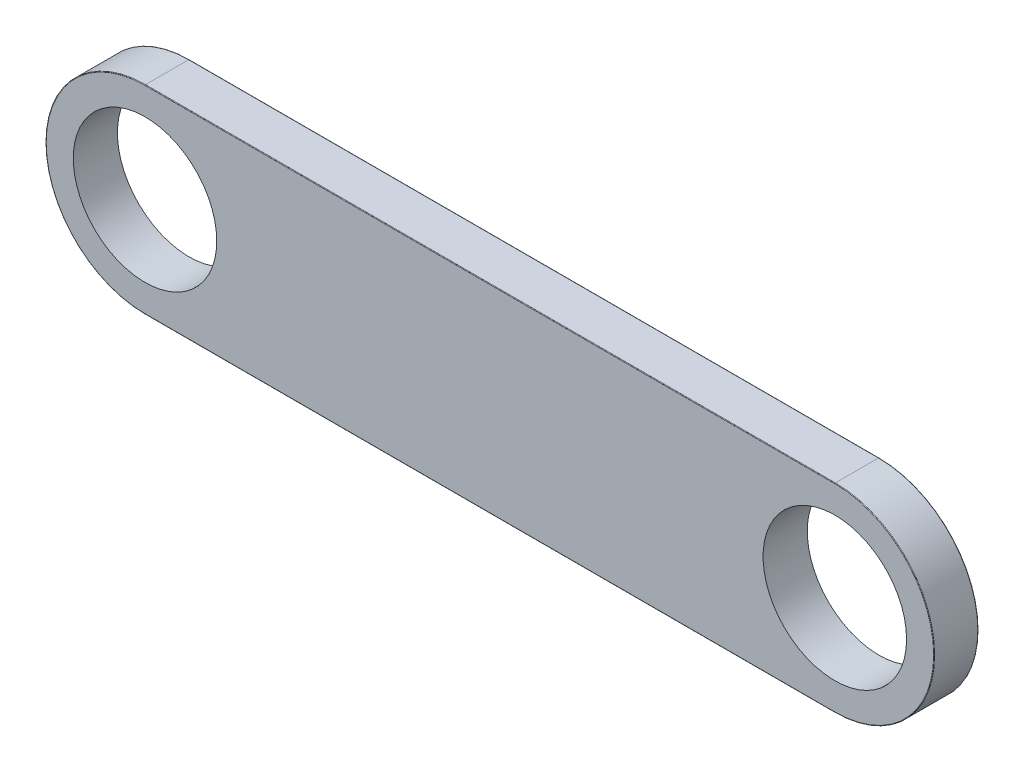
ISO-10303-21;
HEADER;
FILE_DESCRIPTION(('STEP AP214'),'2;1');
FILE_NAME('part.step','',(''),(''),'','','');
FILE_SCHEMA(('AUTOMOTIVE_DESIGN { 1 0 10303 214 1 1 1 1 }'));
ENDSEC;
DATA;
#1=APPLICATION_CONTEXT('core data for automotive mechanical design processes');
#2=APPLICATION_PROTOCOL_DEFINITION('international standard','automotive_design',2000,#1);
#3=PRODUCT_CONTEXT('',#1,'mechanical');
#4=PRODUCT('Part','Part','',(#3));
#5=PRODUCT_RELATED_PRODUCT_CATEGORY('part','',(#4));
#6=PRODUCT_DEFINITION_FORMATION('','',#4);
#7=PRODUCT_DEFINITION_CONTEXT('part definition',#1,'design');
#8=PRODUCT_DEFINITION('design','',#6,#7);
#9=PRODUCT_DEFINITION_SHAPE('','',#8);
#10=(LENGTH_UNIT() NAMED_UNIT(*) SI_UNIT(.MILLI.,.METRE.));
#11=(NAMED_UNIT(*) PLANE_ANGLE_UNIT() SI_UNIT($,.RADIAN.));
#12=(NAMED_UNIT(*) SI_UNIT($,.STERADIAN.) SOLID_ANGLE_UNIT());
#13=UNCERTAINTY_MEASURE_WITH_UNIT(LENGTH_MEASURE(1.E-05),#10,'distance_accuracy_value','');
#14=(GEOMETRIC_REPRESENTATION_CONTEXT(3) GLOBAL_UNCERTAINTY_ASSIGNED_CONTEXT((#13)) GLOBAL_UNIT_ASSIGNED_CONTEXT((#10,
#11,#12)) REPRESENTATION_CONTEXT('',''));
#15=CARTESIAN_POINT('',(0.,0.,0.));
#16=DIRECTION('',(0.,0.,1.));
#17=DIRECTION('',(1.,0.,0.));
#18=AXIS2_PLACEMENT_3D('',#15,#16,#17);
#19=CARTESIAN_POINT('',(0.,0.,8.));
#20=DIRECTION('',(0.,0.,1.));
#21=DIRECTION('',(1.,0.,0.));
#22=AXIS2_PLACEMENT_3D('',#19,#20,#21);
#23=PLANE('',#22);
#24=DIRECTION('',(1.,0.,0.));
#25=VECTOR('',#24,1.);
#26=CARTESIAN_POINT('',(125.,-17.9,8.));
#27=LINE('',#26,#25);
#28=CARTESIAN_POINT('',(0.,-17.9,8.));
#29=VERTEX_POINT('',#28);
#30=CARTESIAN_POINT('',(125.,-17.9,8.));
#31=VERTEX_POINT('',#30);
#32=EDGE_CURVE('E52',#29,#31,#27,.T.);
#33=ORIENTED_EDGE('',*,*,#32,.T.);
#34=CARTESIAN_POINT('',(125.,0.,8.));
#35=DIRECTION('',(0.,0.,1.));
#36=DIRECTION('',(1.,0.,0.));
#37=AXIS2_PLACEMENT_3D('',#34,#35,#36);
#38=CIRCLE('',#37,17.9);
#39=CARTESIAN_POINT('',(125.,17.9,8.));
#40=VERTEX_POINT('',#39);
#41=EDGE_CURVE('E111',#31,#40,#38,.T.);
#42=ORIENTED_EDGE('',*,*,#41,.T.);
#43=DIRECTION('',(-1.,0.,0.));
#44=VECTOR('',#43,1.);
#45=CARTESIAN_POINT('',(0.,17.9,8.));
#46=LINE('',#45,#44);
#47=CARTESIAN_POINT('',(0.,17.9,8.));
#48=VERTEX_POINT('',#47);
#49=EDGE_CURVE('E135',#40,#48,#46,.T.);
#50=ORIENTED_EDGE('',*,*,#49,.T.);
#51=CARTESIAN_POINT('',(0.,0.,8.));
#52=DIRECTION('',(0.,0.,1.));
#53=DIRECTION('',(1.,0.,0.));
#54=AXIS2_PLACEMENT_3D('',#51,#52,#53);
#55=CIRCLE('',#54,17.9);
#56=EDGE_CURVE('E57',#48,#29,#55,.T.);
#57=ORIENTED_EDGE('',*,*,#56,.T.);
#58=EDGE_LOOP('',(#33,#42,#50,#57));
#59=FACE_BOUND('',#58,.T.);
#60=CARTESIAN_POINT('',(0.,0.,8.));
#61=DIRECTION('',(0.,0.,1.));
#62=DIRECTION('',(1.,0.,0.));
#63=AXIS2_PLACEMENT_3D('',#60,#61,#62);
#64=CIRCLE('',#63,13.);
#65=CARTESIAN_POINT('',(13.,0.,8.));
#66=VERTEX_POINT('',#65);
#67=EDGE_CURVE('E172',#66,#66,#64,.T.);
#68=ORIENTED_EDGE('',*,*,#67,.F.);
#69=EDGE_LOOP('',(#68));
#70=FACE_BOUND('',#69,.T.);
#71=CARTESIAN_POINT('',(125.,0.,8.));
#72=DIRECTION('',(0.,0.,1.));
#73=DIRECTION('',(1.,0.,0.));
#74=AXIS2_PLACEMENT_3D('',#71,#72,#73);
#75=CIRCLE('',#74,13.);
#76=CARTESIAN_POINT('',(138.,0.,8.));
#77=VERTEX_POINT('',#76);
#78=EDGE_CURVE('E164',#77,#77,#75,.T.);
#79=ORIENTED_EDGE('',*,*,#78,.F.);
#80=EDGE_LOOP('',(#79));
#81=FACE_BOUND('',#80,.T.);
#82=ADVANCED_FACE('F35',(#59,#70,#81),#23,.T.);
#83=CARTESIAN_POINT('',(0.,0.,0.));
#84=DIRECTION('',(0.,0.,1.));
#85=DIRECTION('',(1.,0.,0.));
#86=AXIS2_PLACEMENT_3D('',#83,#84,#85);
#87=PLANE('',#86);
#88=DIRECTION('',(-1.,0.,0.));
#89=VECTOR('',#88,1.);
#90=CARTESIAN_POINT('',(0.,17.9,0.));
#91=LINE('',#90,#89);
#92=CARTESIAN_POINT('',(0.,17.9,0.));
#93=VERTEX_POINT('',#92);
#94=CARTESIAN_POINT('',(125.,17.9,0.));
#95=VERTEX_POINT('',#94);
#96=EDGE_CURVE('E182',#93,#95,#91,.F.);
#97=ORIENTED_EDGE('',*,*,#96,.T.);
#98=CARTESIAN_POINT('',(125.,0.,0.));
#99=DIRECTION('',(0.,0.,1.));
#100=DIRECTION('',(1.,0.,0.));
#101=AXIS2_PLACEMENT_3D('',#98,#99,#100);
#102=CIRCLE('',#101,17.9);
#103=CARTESIAN_POINT('',(125.,-17.9,0.));
#104=VERTEX_POINT('',#103);
#105=EDGE_CURVE('E188',#95,#104,#102,.F.);
#106=ORIENTED_EDGE('',*,*,#105,.T.);
#107=DIRECTION('',(1.,0.,0.));
#108=VECTOR('',#107,1.);
#109=CARTESIAN_POINT('',(0.,-17.9,0.));
#110=LINE('',#109,#108);
#111=CARTESIAN_POINT('',(0.,-17.9,0.));
#112=VERTEX_POINT('',#111);
#113=EDGE_CURVE('E186',#104,#112,#110,.F.);
#114=ORIENTED_EDGE('',*,*,#113,.T.);
#115=CARTESIAN_POINT('',(0.,0.,0.));
#116=DIRECTION('',(0.,0.,1.));
#117=DIRECTION('',(1.,0.,0.));
#118=AXIS2_PLACEMENT_3D('',#115,#116,#117);
#119=CIRCLE('',#118,17.9);
#120=EDGE_CURVE('E184',#112,#93,#119,.F.);
#121=ORIENTED_EDGE('',*,*,#120,.T.);
#122=EDGE_LOOP('',(#97,#106,#114,#121));
#123=FACE_BOUND('',#122,.T.);
#124=CARTESIAN_POINT('',(0.,0.,0.));
#125=DIRECTION('',(0.,0.,1.));
#126=DIRECTION('',(1.,0.,0.));
#127=AXIS2_PLACEMENT_3D('',#124,#125,#126);
#128=CIRCLE('',#127,13.);
#129=CARTESIAN_POINT('',(13.,0.,0.));
#130=VERTEX_POINT('',#129);
#131=EDGE_CURVE('E169',#130,#130,#128,.T.);
#132=ORIENTED_EDGE('',*,*,#131,.T.);
#133=EDGE_LOOP('',(#132));
#134=FACE_BOUND('',#133,.T.);
#135=CARTESIAN_POINT('',(125.,0.,0.));
#136=DIRECTION('',(0.,0.,1.));
#137=DIRECTION('',(1.,0.,0.));
#138=AXIS2_PLACEMENT_3D('',#135,#136,#137);
#139=CIRCLE('',#138,13.);
#140=CARTESIAN_POINT('',(138.,0.,0.));
#141=VERTEX_POINT('',#140);
#142=EDGE_CURVE('E158',#141,#141,#139,.T.);
#143=ORIENTED_EDGE('',*,*,#142,.T.);
#144=EDGE_LOOP('',(#143));
#145=FACE_BOUND('',#144,.T.);
#146=ADVANCED_FACE('F228',(#123,#134,#145),#87,.F.);
#147=CARTESIAN_POINT('',(0.,0.,8.));
#148=DIRECTION('',(0.,0.,-1.));
#149=DIRECTION('',(-1.,0.,0.));
#150=AXIS2_PLACEMENT_3D('',#147,#148,#149);
#151=CYLINDRICAL_SURFACE('',#150,18.);
#152=DIRECTION('',(0.,0.,-1.));
#153=VECTOR('',#152,1.);
#154=CARTESIAN_POINT('',(0.,18.,8.));
#155=LINE('',#154,#153);
#156=CARTESIAN_POINT('',(0.,18.,7.9));
#157=VERTEX_POINT('',#156);
#158=CARTESIAN_POINT('',(0.,18.,0.0999999999999994));
#159=VERTEX_POINT('',#158);
#160=EDGE_CURVE('E106',#157,#159,#155,.T.);
#161=ORIENTED_EDGE('',*,*,#160,.T.);
#162=CARTESIAN_POINT('',(0.,0.,0.0999999999999994));
#163=DIRECTION('',(0.,0.,1.));
#164=DIRECTION('',(1.,0.,0.));
#165=AXIS2_PLACEMENT_3D('',#162,#163,#164);
#166=CIRCLE('',#165,18.);
#167=CARTESIAN_POINT('',(0.,-18.,0.0999999999999994));
#168=VERTEX_POINT('',#167);
#169=EDGE_CURVE('E197',#159,#168,#166,.T.);
#170=ORIENTED_EDGE('',*,*,#169,.T.);
#171=DIRECTION('',(0.,0.,-1.));
#172=VECTOR('',#171,1.);
#173=CARTESIAN_POINT('',(0.,-18.,8.));
#174=LINE('',#173,#172);
#175=CARTESIAN_POINT('',(0.,-18.,7.9));
#176=VERTEX_POINT('',#175);
#177=EDGE_CURVE('E132',#176,#168,#174,.T.);
#178=ORIENTED_EDGE('',*,*,#177,.F.);
#179=CARTESIAN_POINT('',(0.,0.,7.9));
#180=DIRECTION('',(0.,0.,1.));
#181=DIRECTION('',(1.,0.,0.));
#182=AXIS2_PLACEMENT_3D('',#179,#180,#181);
#183=CIRCLE('',#182,18.);
#184=EDGE_CURVE('E195',#176,#157,#183,.F.);
#185=ORIENTED_EDGE('',*,*,#184,.T.);
#186=EDGE_LOOP('',(#161,#170,#178,#185));
#187=FACE_BOUND('',#186,.T.);
#188=ADVANCED_FACE('F210',(#187),#151,.T.);
#189=CARTESIAN_POINT('',(0.,-18.,8.));
#190=DIRECTION('',(0.,1.,0.));
#191=DIRECTION('',(0.,0.,1.));
#192=AXIS2_PLACEMENT_3D('',#189,#190,#191);
#193=PLANE('',#192);
#194=ORIENTED_EDGE('',*,*,#177,.T.);
#195=DIRECTION('',(1.,0.,0.));
#196=VECTOR('',#195,1.);
#197=CARTESIAN_POINT('',(0.,-18.,0.0999999999999994));
#198=LINE('',#197,#196);
#199=CARTESIAN_POINT('',(125.,-18.,0.0999999999999994));
#200=VERTEX_POINT('',#199);
#201=EDGE_CURVE('E193',#168,#200,#198,.T.);
#202=ORIENTED_EDGE('',*,*,#201,.T.);
#203=DIRECTION('',(0.,0.,-1.));
#204=VECTOR('',#203,1.);
#205=CARTESIAN_POINT('',(125.,-18.,8.));
#206=LINE('',#205,#204);
#207=CARTESIAN_POINT('',(125.,-18.,7.9));
#208=VERTEX_POINT('',#207);
#209=EDGE_CURVE('E123',#208,#200,#206,.T.);
#210=ORIENTED_EDGE('',*,*,#209,.F.);
#211=DIRECTION('',(1.,0.,0.));
#212=VECTOR('',#211,1.);
#213=CARTESIAN_POINT('',(0.,-18.,7.9));
#214=LINE('',#213,#212);
#215=EDGE_CURVE('E191',#208,#176,#214,.F.);
#216=ORIENTED_EDGE('',*,*,#215,.T.);
#217=EDGE_LOOP('',(#194,#202,#210,#216));
#218=FACE_BOUND('',#217,.T.);
#219=ADVANCED_FACE('F208',(#218),#193,.F.);
#220=CARTESIAN_POINT('',(125.,0.,8.));
#221=DIRECTION('',(0.,0.,-1.));
#222=DIRECTION('',(-1.,0.,0.));
#223=AXIS2_PLACEMENT_3D('',#220,#221,#222);
#224=CYLINDRICAL_SURFACE('',#223,18.);
#225=ORIENTED_EDGE('',*,*,#209,.T.);
#226=CARTESIAN_POINT('',(125.,0.,0.0999999999999994));
#227=DIRECTION('',(0.,0.,1.));
#228=DIRECTION('',(1.,0.,0.));
#229=AXIS2_PLACEMENT_3D('',#226,#227,#228);
#230=CIRCLE('',#229,18.);
#231=CARTESIAN_POINT('',(125.,18.,0.0999999999999994));
#232=VERTEX_POINT('',#231);
#233=EDGE_CURVE('E122',#200,#232,#230,.T.);
#234=ORIENTED_EDGE('',*,*,#233,.T.);
#235=DIRECTION('',(0.,0.,-1.));
#236=VECTOR('',#235,1.);
#237=CARTESIAN_POINT('',(125.,18.,8.));
#238=LINE('',#237,#236);
#239=CARTESIAN_POINT('',(125.,18.,7.9));
#240=VERTEX_POINT('',#239);
#241=EDGE_CURVE('E104',#240,#232,#238,.T.);
#242=ORIENTED_EDGE('',*,*,#241,.F.);
#243=CARTESIAN_POINT('',(125.,0.,7.9));
#244=DIRECTION('',(0.,0.,1.));
#245=DIRECTION('',(1.,0.,0.));
#246=AXIS2_PLACEMENT_3D('',#243,#244,#245);
#247=CIRCLE('',#246,18.);
#248=EDGE_CURVE('E119',#240,#208,#247,.F.);
#249=ORIENTED_EDGE('',*,*,#248,.T.);
#250=EDGE_LOOP('',(#225,#234,#242,#249));
#251=FACE_BOUND('',#250,.T.);
#252=ADVANCED_FACE('F118',(#251),#224,.T.);
#253=CARTESIAN_POINT('',(0.,18.,8.));
#254=DIRECTION('',(0.,-1.,0.));
#255=DIRECTION('',(0.,0.,-1.));
#256=AXIS2_PLACEMENT_3D('',#253,#254,#255);
#257=PLANE('',#256);
#258=ORIENTED_EDGE('',*,*,#241,.T.);
#259=DIRECTION('',(-1.,0.,0.));
#260=VECTOR('',#259,1.);
#261=CARTESIAN_POINT('',(0.,18.,0.0999999999999994));
#262=LINE('',#261,#260);
#263=EDGE_CURVE('E11',#232,#159,#262,.T.);
#264=ORIENTED_EDGE('',*,*,#263,.T.);
#265=ORIENTED_EDGE('',*,*,#160,.F.);
#266=DIRECTION('',(-1.,0.,0.));
#267=VECTOR('',#266,1.);
#268=CARTESIAN_POINT('',(125.,18.,7.9));
#269=LINE('',#268,#267);
#270=EDGE_CURVE('E44',#157,#240,#269,.F.);
#271=ORIENTED_EDGE('',*,*,#270,.T.);
#272=EDGE_LOOP('',(#258,#264,#265,#271));
#273=FACE_BOUND('',#272,.T.);
#274=ADVANCED_FACE('F103',(#273),#257,.F.);
#275=CARTESIAN_POINT('',(0.,0.,8.));
#276=DIRECTION('',(0.,0.,-1.));
#277=DIRECTION('',(-1.,0.,0.));
#278=AXIS2_PLACEMENT_3D('',#275,#276,#277);
#279=CYLINDRICAL_SURFACE('',#278,13.);
#280=ORIENTED_EDGE('',*,*,#67,.T.);
#281=EDGE_LOOP('',(#280));
#282=FACE_BOUND('',#281,.T.);
#283=ORIENTED_EDGE('',*,*,#131,.F.);
#284=EDGE_LOOP('',(#283));
#285=FACE_BOUND('',#284,.T.);
#286=ADVANCED_FACE('F237',(#282,#285),#279,.F.);
#287=CARTESIAN_POINT('',(125.,0.,8.));
#288=DIRECTION('',(0.,0.,-1.));
#289=DIRECTION('',(-1.,0.,0.));
#290=AXIS2_PLACEMENT_3D('',#287,#288,#289);
#291=CYLINDRICAL_SURFACE('',#290,13.);
#292=ORIENTED_EDGE('',*,*,#78,.T.);
#293=EDGE_LOOP('',(#292));
#294=FACE_BOUND('',#293,.T.);
#295=ORIENTED_EDGE('',*,*,#142,.F.);
#296=EDGE_LOOP('',(#295));
#297=FACE_BOUND('',#296,.T.);
#298=ADVANCED_FACE('F270',(#294,#297),#291,.F.);
#299=CARTESIAN_POINT('',(0.,0.,0.0999999999999994));
#300=DIRECTION('',(0.,0.,1.));
#301=DIRECTION('',(1.,0.,0.));
#302=AXIS2_PLACEMENT_3D('',#299,#300,#301);
#303=TOROIDAL_SURFACE('',#302,17.9,0.1);
#304=CARTESIAN_POINT('',(0.,17.9,0.1));
#305=DIRECTION('',(1.,0.,0.));
#306=DIRECTION('',(0.,0.,-1.));
#307=AXIS2_PLACEMENT_3D('',#304,#305,#306);
#308=CIRCLE('',#307,0.1);
#309=EDGE_CURVE('E151',#93,#159,#308,.T.);
#310=ORIENTED_EDGE('',*,*,#309,.F.);
#311=ORIENTED_EDGE('',*,*,#120,.F.);
#312=CARTESIAN_POINT('',(0.,-17.9,0.0999999999999994));
#313=DIRECTION('',(1.,0.,0.));
#314=DIRECTION('',(0.,0.,-1.));
#315=AXIS2_PLACEMENT_3D('',#312,#313,#314);
#316=CIRCLE('',#315,0.1);
#317=EDGE_CURVE('E140',#168,#112,#316,.T.);
#318=ORIENTED_EDGE('',*,*,#317,.F.);
#319=ORIENTED_EDGE('',*,*,#169,.F.);
#320=EDGE_LOOP('',(#310,#311,#318,#319));
#321=FACE_BOUND('',#320,.T.);
#322=ADVANCED_FACE('F213',(#321),#303,.T.);
#323=CARTESIAN_POINT('',(0.,-17.9,0.0999999999999994));
#324=DIRECTION('',(1.,0.,0.));
#325=DIRECTION('',(0.,0.,-1.));
#326=AXIS2_PLACEMENT_3D('',#323,#324,#325);
#327=CYLINDRICAL_SURFACE('',#326,0.1);
#328=ORIENTED_EDGE('',*,*,#317,.T.);
#329=ORIENTED_EDGE('',*,*,#113,.F.);
#330=CARTESIAN_POINT('',(125.,-17.9,0.0999999999999994));
#331=DIRECTION('',(1.,0.,0.));
#332=DIRECTION('',(0.,0.,-1.));
#333=AXIS2_PLACEMENT_3D('',#330,#331,#332);
#334=CIRCLE('',#333,0.1);
#335=EDGE_CURVE('E145',#200,#104,#334,.T.);
#336=ORIENTED_EDGE('',*,*,#335,.F.);
#337=ORIENTED_EDGE('',*,*,#201,.F.);
#338=EDGE_LOOP('',(#328,#329,#336,#337));
#339=FACE_BOUND('',#338,.T.);
#340=ADVANCED_FACE('F216',(#339),#327,.T.);
#341=CARTESIAN_POINT('',(0.,17.9,0.0999999999999994));
#342=DIRECTION('',(-1.,0.,0.));
#343=DIRECTION('',(0.,0.,1.));
#344=AXIS2_PLACEMENT_3D('',#341,#342,#343);
#345=CYLINDRICAL_SURFACE('',#344,0.1);
#346=ORIENTED_EDGE('',*,*,#309,.T.);
#347=ORIENTED_EDGE('',*,*,#263,.F.);
#348=CARTESIAN_POINT('',(125.,17.9,0.1));
#349=DIRECTION('',(1.,0.,0.));
#350=DIRECTION('',(0.,0.,-1.));
#351=AXIS2_PLACEMENT_3D('',#348,#349,#350);
#352=CIRCLE('',#351,0.1);
#353=EDGE_CURVE('E143',#95,#232,#352,.T.);
#354=ORIENTED_EDGE('',*,*,#353,.F.);
#355=ORIENTED_EDGE('',*,*,#96,.F.);
#356=EDGE_LOOP('',(#346,#347,#354,#355));
#357=FACE_BOUND('',#356,.T.);
#358=ADVANCED_FACE('F219',(#357),#345,.T.);
#359=CARTESIAN_POINT('',(125.,0.,0.0999999999999994));
#360=DIRECTION('',(0.,0.,1.));
#361=DIRECTION('',(1.,0.,0.));
#362=AXIS2_PLACEMENT_3D('',#359,#360,#361);
#363=TOROIDAL_SURFACE('',#362,17.9,0.1);
#364=ORIENTED_EDGE('',*,*,#335,.T.);
#365=ORIENTED_EDGE('',*,*,#105,.F.);
#366=ORIENTED_EDGE('',*,*,#353,.T.);
#367=ORIENTED_EDGE('',*,*,#233,.F.);
#368=EDGE_LOOP('',(#364,#365,#366,#367));
#369=FACE_BOUND('',#368,.T.);
#370=ADVANCED_FACE('F217',(#369),#363,.T.);
#371=CARTESIAN_POINT('',(0.,0.,7.9));
#372=DIRECTION('',(0.,0.,1.));
#373=DIRECTION('',(1.,0.,0.));
#374=AXIS2_PLACEMENT_3D('',#371,#372,#373);
#375=TOROIDAL_SURFACE('',#374,17.9,0.1);
#376=CARTESIAN_POINT('',(0.,17.9,7.9));
#377=DIRECTION('',(1.,0.,0.));
#378=DIRECTION('',(0.,0.,-1.));
#379=AXIS2_PLACEMENT_3D('',#376,#377,#378);
#380=CIRCLE('',#379,0.1);
#381=EDGE_CURVE('E137',#157,#48,#380,.T.);
#382=ORIENTED_EDGE('',*,*,#381,.F.);
#383=ORIENTED_EDGE('',*,*,#184,.F.);
#384=CARTESIAN_POINT('',(0.,-17.9,7.9));
#385=DIRECTION('',(1.,0.,0.));
#386=DIRECTION('',(0.,0.,-1.));
#387=AXIS2_PLACEMENT_3D('',#384,#385,#386);
#388=CIRCLE('',#387,0.1);
#389=EDGE_CURVE('E39',#29,#176,#388,.T.);
#390=ORIENTED_EDGE('',*,*,#389,.F.);
#391=ORIENTED_EDGE('',*,*,#56,.F.);
#392=EDGE_LOOP('',(#382,#383,#390,#391));
#393=FACE_BOUND('',#392,.T.);
#394=ADVANCED_FACE('F37',(#393),#375,.T.);
#395=CARTESIAN_POINT('',(0.,-17.9,7.9));
#396=DIRECTION('',(-1.,0.,0.));
#397=DIRECTION('',(0.,0.,1.));
#398=AXIS2_PLACEMENT_3D('',#395,#396,#397);
#399=CYLINDRICAL_SURFACE('',#398,0.1);
#400=ORIENTED_EDGE('',*,*,#389,.T.);
#401=ORIENTED_EDGE('',*,*,#215,.F.);
#402=CARTESIAN_POINT('',(125.,-17.9,7.9));
#403=DIRECTION('',(1.,0.,0.));
#404=DIRECTION('',(0.,0.,-1.));
#405=AXIS2_PLACEMENT_3D('',#402,#403,#404);
#406=CIRCLE('',#405,0.1);
#407=EDGE_CURVE('E130',#31,#208,#406,.T.);
#408=ORIENTED_EDGE('',*,*,#407,.F.);
#409=ORIENTED_EDGE('',*,*,#32,.F.);
#410=EDGE_LOOP('',(#400,#401,#408,#409));
#411=FACE_BOUND('',#410,.T.);
#412=ADVANCED_FACE('F205',(#411),#399,.T.);
#413=CARTESIAN_POINT('',(0.,17.9,7.9));
#414=DIRECTION('',(1.,0.,0.));
#415=DIRECTION('',(0.,0.,-1.));
#416=AXIS2_PLACEMENT_3D('',#413,#414,#415);
#417=CYLINDRICAL_SURFACE('',#416,0.1);
#418=ORIENTED_EDGE('',*,*,#381,.T.);
#419=ORIENTED_EDGE('',*,*,#49,.F.);
#420=CARTESIAN_POINT('',(125.,17.9,7.9));
#421=DIRECTION('',(1.,0.,0.));
#422=DIRECTION('',(0.,0.,-1.));
#423=AXIS2_PLACEMENT_3D('',#420,#421,#422);
#424=CIRCLE('',#423,0.1);
#425=EDGE_CURVE('E128',#240,#40,#424,.T.);
#426=ORIENTED_EDGE('',*,*,#425,.F.);
#427=ORIENTED_EDGE('',*,*,#270,.F.);
#428=EDGE_LOOP('',(#418,#419,#426,#427));
#429=FACE_BOUND('',#428,.T.);
#430=ADVANCED_FACE('F134',(#429),#417,.T.);
#431=CARTESIAN_POINT('',(125.,0.,7.9));
#432=DIRECTION('',(0.,0.,1.));
#433=DIRECTION('',(1.,0.,0.));
#434=AXIS2_PLACEMENT_3D('',#431,#432,#433);
#435=TOROIDAL_SURFACE('',#434,17.9,0.1);
#436=ORIENTED_EDGE('',*,*,#407,.T.);
#437=ORIENTED_EDGE('',*,*,#248,.F.);
#438=ORIENTED_EDGE('',*,*,#425,.T.);
#439=ORIENTED_EDGE('',*,*,#41,.F.);
#440=EDGE_LOOP('',(#436,#437,#438,#439));
#441=FACE_BOUND('',#440,.T.);
#442=ADVANCED_FACE('F126',(#441),#435,.T.);
#443=CLOSED_SHELL('',(#82,#146,#188,#219,#252,#274,#286,#298,#322,#340,#358,#370,#394,#412,#430,#442));
#444=MANIFOLD_SOLID_BREP('B2',#443);
#445=ADVANCED_BREP_SHAPE_REPRESENTATION('',(#18,#444),#14);
#446=SHAPE_DEFINITION_REPRESENTATION(#9,#445);
ENDSEC;
END-ISO-10303-21;
